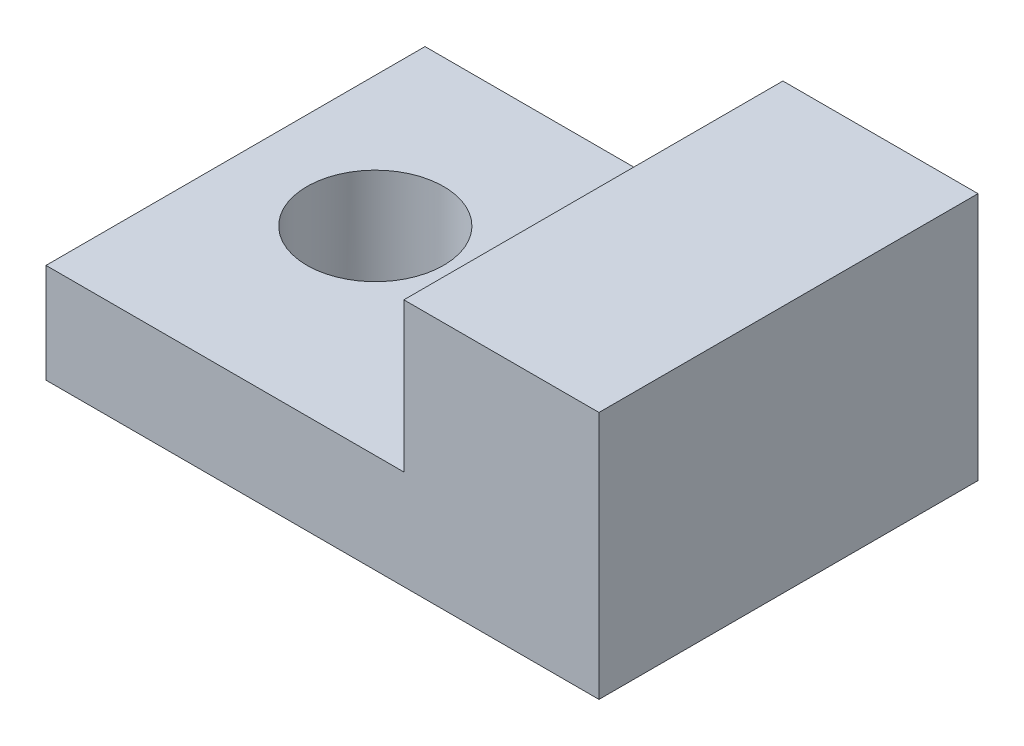
ISO-10303-21;
HEADER;
FILE_DESCRIPTION(('STEP AP214'),'2;1');
FILE_NAME('part.step','',(''),(''),'','','');
FILE_SCHEMA(('AUTOMOTIVE_DESIGN { 1 0 10303 214 1 1 1 1 }'));
ENDSEC;
DATA;
#1=APPLICATION_CONTEXT('core data for automotive mechanical design processes');
#2=APPLICATION_PROTOCOL_DEFINITION('international standard','automotive_design',2000,#1);
#3=PRODUCT_CONTEXT('',#1,'mechanical');
#4=PRODUCT('Part','Part','',(#3));
#5=PRODUCT_RELATED_PRODUCT_CATEGORY('part','',(#4));
#6=PRODUCT_DEFINITION_FORMATION('','',#4);
#7=PRODUCT_DEFINITION_CONTEXT('part definition',#1,'design');
#8=PRODUCT_DEFINITION('design','',#6,#7);
#9=PRODUCT_DEFINITION_SHAPE('','',#8);
#10=(LENGTH_UNIT() NAMED_UNIT(*) SI_UNIT(.MILLI.,.METRE.));
#11=(NAMED_UNIT(*) PLANE_ANGLE_UNIT() SI_UNIT($,.RADIAN.));
#12=(NAMED_UNIT(*) SI_UNIT($,.STERADIAN.) SOLID_ANGLE_UNIT());
#13=UNCERTAINTY_MEASURE_WITH_UNIT(LENGTH_MEASURE(1.E-05),#10,'distance_accuracy_value','');
#14=(GEOMETRIC_REPRESENTATION_CONTEXT(3) GLOBAL_UNCERTAINTY_ASSIGNED_CONTEXT((#13)) GLOBAL_UNIT_ASSIGNED_CONTEXT((#10,
#11,#12)) REPRESENTATION_CONTEXT('',''));
#15=CARTESIAN_POINT('',(0.,0.,0.));
#16=DIRECTION('',(0.,0.,1.));
#17=DIRECTION('',(1.,0.,0.));
#18=AXIS2_PLACEMENT_3D('',#15,#16,#17);
#19=CARTESIAN_POINT('',(0.,7.9375,0.));
#20=DIRECTION('',(-1.,0.,0.));
#21=DIRECTION('',(0.,0.,1.));
#22=AXIS2_PLACEMENT_3D('',#19,#20,#21);
#23=PLANE('',#22);
#24=DIRECTION('',(0.,0.,1.));
#25=VECTOR('',#24,1.);
#26=CARTESIAN_POINT('',(0.,3.175,-25.4));
#27=LINE('',#26,#25);
#28=CARTESIAN_POINT('',(0.,3.175,-12.1046875));
#29=VERTEX_POINT('',#28);
#30=CARTESIAN_POINT('',(0.,3.175,0.));
#31=VERTEX_POINT('',#30);
#32=EDGE_CURVE('E125',#29,#31,#27,.T.);
#33=ORIENTED_EDGE('',*,*,#32,.F.);
#34=DIRECTION('',(0.,-1.,0.));
#35=VECTOR('',#34,1.);
#36=CARTESIAN_POINT('',(0.,7.9375,-12.1046875));
#37=LINE('',#36,#35);
#38=CARTESIAN_POINT('',(0.,0.,-12.1046875));
#39=VERTEX_POINT('',#38);
#40=EDGE_CURVE('E99',#29,#39,#37,.T.);
#41=ORIENTED_EDGE('',*,*,#40,.T.);
#42=DIRECTION('',(0.,0.,-1.));
#43=VECTOR('',#42,1.);
#44=CARTESIAN_POINT('',(0.,0.,0.));
#45=LINE('',#44,#43);
#46=CARTESIAN_POINT('',(0.,0.,0.));
#47=VERTEX_POINT('',#46);
#48=EDGE_CURVE('E93',#47,#39,#45,.T.);
#49=ORIENTED_EDGE('',*,*,#48,.F.);
#50=DIRECTION('',(0.,-1.,0.));
#51=VECTOR('',#50,1.);
#52=CARTESIAN_POINT('',(0.,7.9375,0.));
#53=LINE('',#52,#51);
#54=EDGE_CURVE('E75',#31,#47,#53,.T.);
#55=ORIENTED_EDGE('',*,*,#54,.F.);
#56=EDGE_LOOP('',(#33,#41,#49,#55));
#57=FACE_BOUND('',#56,.T.);
#58=ADVANCED_FACE('F33',(#57),#23,.T.);
#59=CARTESIAN_POINT('',(0.,7.9375,0.));
#60=DIRECTION('',(0.,0.,-1.));
#61=DIRECTION('',(-1.,0.,0.));
#62=AXIS2_PLACEMENT_3D('',#59,#60,#61);
#63=PLANE('',#62);
#64=DIRECTION('',(1.,0.,0.));
#65=VECTOR('',#64,1.);
#66=CARTESIAN_POINT('',(0.,7.9375,0.));
#67=LINE('',#66,#65);
#68=CARTESIAN_POINT('',(11.43,7.9375,0.));
#69=VERTEX_POINT('',#68);
#70=CARTESIAN_POINT('',(17.6609375,7.9375,0.));
#71=VERTEX_POINT('',#70);
#72=EDGE_CURVE('E55',#69,#71,#67,.T.);
#73=ORIENTED_EDGE('',*,*,#72,.F.);
#74=DIRECTION('',(0.,1.,0.));
#75=VECTOR('',#74,1.);
#76=CARTESIAN_POINT('',(11.43,7.9375,0.));
#77=LINE('',#76,#75);
#78=CARTESIAN_POINT('',(11.43,3.175,0.));
#79=VERTEX_POINT('',#78);
#80=EDGE_CURVE('E47',#79,#69,#77,.T.);
#81=ORIENTED_EDGE('',*,*,#80,.F.);
#82=DIRECTION('',(1.,0.,0.));
#83=VECTOR('',#82,1.);
#84=CARTESIAN_POINT('',(0.,3.175,0.));
#85=LINE('',#84,#83);
#86=EDGE_CURVE('E82',#31,#79,#85,.T.);
#87=ORIENTED_EDGE('',*,*,#86,.F.);
#88=ORIENTED_EDGE('',*,*,#54,.T.);
#89=DIRECTION('',(1.,0.,0.));
#90=VECTOR('',#89,1.);
#91=CARTESIAN_POINT('',(0.,0.,0.));
#92=LINE('',#91,#90);
#93=CARTESIAN_POINT('',(17.6609375,0.,0.));
#94=VERTEX_POINT('',#93);
#95=EDGE_CURVE('E78',#47,#94,#92,.T.);
#96=ORIENTED_EDGE('',*,*,#95,.T.);
#97=DIRECTION('',(0.,-1.,0.));
#98=VECTOR('',#97,1.);
#99=CARTESIAN_POINT('',(17.6609375,7.9375,0.));
#100=LINE('',#99,#98);
#101=EDGE_CURVE('E86',#71,#94,#100,.T.);
#102=ORIENTED_EDGE('',*,*,#101,.F.);
#103=EDGE_LOOP('',(#73,#81,#87,#88,#96,#102));
#104=FACE_BOUND('',#103,.T.);
#105=ADVANCED_FACE('F77',(#104),#63,.F.);
#106=CARTESIAN_POINT('',(17.6609375,7.9375,0.));
#107=DIRECTION('',(-1.,0.,0.));
#108=DIRECTION('',(0.,0.,1.));
#109=AXIS2_PLACEMENT_3D('',#106,#107,#108);
#110=PLANE('',#109);
#111=DIRECTION('',(0.,0.,-1.));
#112=VECTOR('',#111,1.);
#113=CARTESIAN_POINT('',(17.6609375,0.,0.));
#114=LINE('',#113,#112);
#115=CARTESIAN_POINT('',(17.6609375,0.,-12.1046875));
#116=VERTEX_POINT('',#115);
#117=EDGE_CURVE('E95',#94,#116,#114,.T.);
#118=ORIENTED_EDGE('',*,*,#117,.T.);
#119=DIRECTION('',(0.,-1.,0.));
#120=VECTOR('',#119,1.);
#121=CARTESIAN_POINT('',(17.6609375,7.9375,-12.1046875));
#122=LINE('',#121,#120);
#123=CARTESIAN_POINT('',(17.6609375,7.9375,-12.1046875));
#124=VERTEX_POINT('',#123);
#125=EDGE_CURVE('E113',#124,#116,#122,.T.);
#126=ORIENTED_EDGE('',*,*,#125,.F.);
#127=DIRECTION('',(0.,0.,-1.));
#128=VECTOR('',#127,1.);
#129=CARTESIAN_POINT('',(17.6609375,7.9375,0.));
#130=LINE('',#129,#128);
#131=EDGE_CURVE('E121',#71,#124,#130,.T.);
#132=ORIENTED_EDGE('',*,*,#131,.F.);
#133=ORIENTED_EDGE('',*,*,#101,.T.);
#134=EDGE_LOOP('',(#118,#126,#132,#133));
#135=FACE_BOUND('',#134,.T.);
#136=ADVANCED_FACE('F151',(#135),#110,.F.);
#137=CARTESIAN_POINT('',(0.,7.9375,-12.1046875));
#138=DIRECTION('',(0.,0.,-1.));
#139=DIRECTION('',(-1.,0.,0.));
#140=AXIS2_PLACEMENT_3D('',#137,#138,#139);
#141=PLANE('',#140);
#142=DIRECTION('',(0.,-1.,0.));
#143=VECTOR('',#142,1.);
#144=CARTESIAN_POINT('',(11.43,7.9375,-12.1046875));
#145=LINE('',#144,#143);
#146=CARTESIAN_POINT('',(11.43,7.9375,-12.1046875));
#147=VERTEX_POINT('',#146);
#148=CARTESIAN_POINT('',(11.43,3.175,-12.1046875));
#149=VERTEX_POINT('',#148);
#150=EDGE_CURVE('E102',#147,#149,#145,.T.);
#151=ORIENTED_EDGE('',*,*,#150,.F.);
#152=DIRECTION('',(1.,0.,0.));
#153=VECTOR('',#152,1.);
#154=CARTESIAN_POINT('',(0.,7.9375,-12.1046875));
#155=LINE('',#154,#153);
#156=EDGE_CURVE('E96',#147,#124,#155,.T.);
#157=ORIENTED_EDGE('',*,*,#156,.T.);
#158=ORIENTED_EDGE('',*,*,#125,.T.);
#159=DIRECTION('',(1.,0.,0.));
#160=VECTOR('',#159,1.);
#161=CARTESIAN_POINT('',(0.,0.,-12.1046875));
#162=LINE('',#161,#160);
#163=EDGE_CURVE('E101',#39,#116,#162,.T.);
#164=ORIENTED_EDGE('',*,*,#163,.F.);
#165=ORIENTED_EDGE('',*,*,#40,.F.);
#166=DIRECTION('',(-1.,0.,0.));
#167=VECTOR('',#166,1.);
#168=CARTESIAN_POINT('',(0.,3.175,-12.1046875));
#169=LINE('',#168,#167);
#170=EDGE_CURVE('E11',#149,#29,#169,.T.);
#171=ORIENTED_EDGE('',*,*,#170,.F.);
#172=EDGE_LOOP('',(#151,#157,#158,#164,#165,#171));
#173=FACE_BOUND('',#172,.T.);
#174=ADVANCED_FACE('F149',(#173),#141,.T.);
#175=CARTESIAN_POINT('',(0.,7.9375,0.));
#176=DIRECTION('',(0.,-1.,0.));
#177=DIRECTION('',(0.,0.,-1.));
#178=AXIS2_PLACEMENT_3D('',#175,#176,#177);
#179=PLANE('',#178);
#180=ORIENTED_EDGE('',*,*,#156,.F.);
#181=DIRECTION('',(0.,0.,1.));
#182=VECTOR('',#181,1.);
#183=CARTESIAN_POINT('',(11.43,7.9375,0.));
#184=LINE('',#183,#182);
#185=EDGE_CURVE('E40',#147,#69,#184,.T.);
#186=ORIENTED_EDGE('',*,*,#185,.T.);
#187=ORIENTED_EDGE('',*,*,#72,.T.);
#188=ORIENTED_EDGE('',*,*,#131,.T.);
#189=EDGE_LOOP('',(#180,#186,#187,#188));
#190=FACE_BOUND('',#189,.T.);
#191=ADVANCED_FACE('F116',(#190),#179,.F.);
#192=CARTESIAN_POINT('',(0.,0.,0.));
#193=DIRECTION('',(0.,-1.,0.));
#194=DIRECTION('',(0.,0.,-1.));
#195=AXIS2_PLACEMENT_3D('',#192,#193,#194);
#196=PLANE('',#195);
#197=CARTESIAN_POINT('',(4.1671875,0.,-6.35));
#198=DIRECTION('',(0.,-1.,0.));
#199=DIRECTION('',(0.,0.,-1.));
#200=AXIS2_PLACEMENT_3D('',#197,#198,#199);
#201=CIRCLE('',#200,2.1828125);
#202=CARTESIAN_POINT('',(4.1671875,0.,-8.5328125));
#203=VERTEX_POINT('',#202);
#204=EDGE_CURVE('E131',#203,#203,#201,.T.);
#205=ORIENTED_EDGE('',*,*,#204,.F.);
#206=EDGE_LOOP('',(#205));
#207=FACE_BOUND('',#206,.T.);
#208=ORIENTED_EDGE('',*,*,#48,.T.);
#209=ORIENTED_EDGE('',*,*,#163,.T.);
#210=ORIENTED_EDGE('',*,*,#117,.F.);
#211=ORIENTED_EDGE('',*,*,#95,.F.);
#212=EDGE_LOOP('',(#208,#209,#210,#211));
#213=FACE_BOUND('',#212,.T.);
#214=ADVANCED_FACE('F91',(#207,#213),#196,.T.);
#215=CARTESIAN_POINT('',(11.43,7.9375,-25.4));
#216=DIRECTION('',(1.,0.,0.));
#217=DIRECTION('',(0.,1.,0.));
#218=AXIS2_PLACEMENT_3D('',#215,#216,#217);
#219=PLANE('',#218);
#220=ORIENTED_EDGE('',*,*,#150,.T.);
#221=DIRECTION('',(0.,0.,1.));
#222=VECTOR('',#221,1.);
#223=CARTESIAN_POINT('',(11.43,3.175,-25.4));
#224=LINE('',#223,#222);
#225=EDGE_CURVE('E106',#149,#79,#224,.T.);
#226=ORIENTED_EDGE('',*,*,#225,.T.);
#227=ORIENTED_EDGE('',*,*,#80,.T.);
#228=ORIENTED_EDGE('',*,*,#185,.F.);
#229=EDGE_LOOP('',(#220,#226,#227,#228));
#230=FACE_BOUND('',#229,.T.);
#231=ADVANCED_FACE('F143',(#230),#219,.F.);
#232=CARTESIAN_POINT('',(0.,3.175,-25.4));
#233=DIRECTION('',(0.,-1.,0.));
#234=DIRECTION('',(0.,0.,-1.));
#235=AXIS2_PLACEMENT_3D('',#232,#233,#234);
#236=PLANE('',#235);
#237=CARTESIAN_POINT('',(4.1671875,3.175,-6.35));
#238=DIRECTION('',(0.,1.,0.));
#239=DIRECTION('',(0.,0.,1.));
#240=AXIS2_PLACEMENT_3D('',#237,#238,#239);
#241=CIRCLE('',#240,2.1828125);
#242=CARTESIAN_POINT('',(4.1671875,3.175,-4.1671875));
#243=VERTEX_POINT('',#242);
#244=EDGE_CURVE('E134',#243,#243,#241,.T.);
#245=ORIENTED_EDGE('',*,*,#244,.F.);
#246=EDGE_LOOP('',(#245));
#247=FACE_BOUND('',#246,.T.);
#248=ORIENTED_EDGE('',*,*,#170,.T.);
#249=ORIENTED_EDGE('',*,*,#32,.T.);
#250=ORIENTED_EDGE('',*,*,#86,.T.);
#251=ORIENTED_EDGE('',*,*,#225,.F.);
#252=EDGE_LOOP('',(#248,#249,#250,#251));
#253=FACE_BOUND('',#252,.T.);
#254=ADVANCED_FACE('F140',(#247,#253),#236,.F.);
#255=CARTESIAN_POINT('',(4.1671875,-22.225,-6.35));
#256=DIRECTION('',(0.,1.,0.));
#257=DIRECTION('',(0.,0.,1.));
#258=AXIS2_PLACEMENT_3D('',#255,#256,#257);
#259=CYLINDRICAL_SURFACE('',#258,2.1828125);
#260=ORIENTED_EDGE('',*,*,#204,.T.);
#261=EDGE_LOOP('',(#260));
#262=FACE_BOUND('',#261,.T.);
#263=ORIENTED_EDGE('',*,*,#244,.T.);
#264=EDGE_LOOP('',(#263));
#265=FACE_BOUND('',#264,.T.);
#266=ADVANCED_FACE('F138',(#262,#265),#259,.F.);
#267=CLOSED_SHELL('',(#58,#105,#136,#174,#191,#214,#231,#254,#266));
#268=MANIFOLD_SOLID_BREP('B2',#267);
#269=ADVANCED_BREP_SHAPE_REPRESENTATION('',(#18,#268),#14);
#270=SHAPE_DEFINITION_REPRESENTATION(#9,#269);
ENDSEC;
END-ISO-10303-21;
